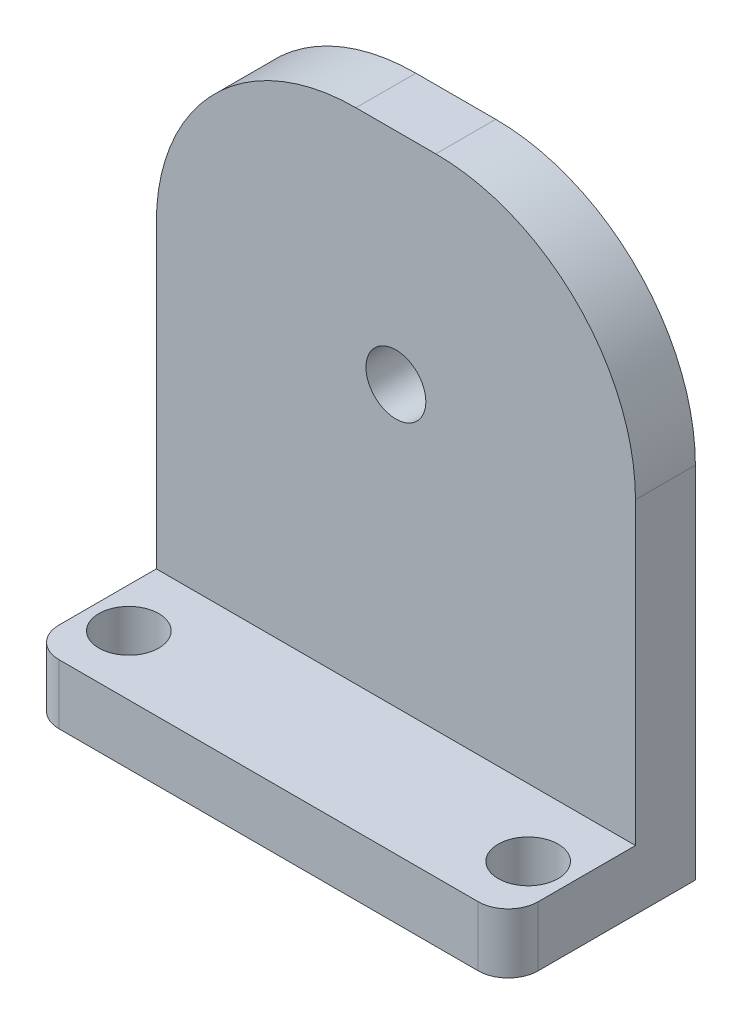
ISO-10303-21;
HEADER;
FILE_DESCRIPTION(('STEP AP214'),'2;1');
FILE_NAME('part.step','',(''),(''),'','','');
FILE_SCHEMA(('AUTOMOTIVE_DESIGN { 1 0 10303 214 1 1 1 1 }'));
ENDSEC;
DATA;
#1=APPLICATION_CONTEXT('core data for automotive mechanical design processes');
#2=APPLICATION_PROTOCOL_DEFINITION('international standard','automotive_design',2000,#1);
#3=PRODUCT_CONTEXT('',#1,'mechanical');
#4=PRODUCT('Part','Part','',(#3));
#5=PRODUCT_RELATED_PRODUCT_CATEGORY('part','',(#4));
#6=PRODUCT_DEFINITION_FORMATION('','',#4);
#7=PRODUCT_DEFINITION_CONTEXT('part definition',#1,'design');
#8=PRODUCT_DEFINITION('design','',#6,#7);
#9=PRODUCT_DEFINITION_SHAPE('','',#8);
#10=(LENGTH_UNIT() NAMED_UNIT(*) SI_UNIT(.MILLI.,.METRE.));
#11=(NAMED_UNIT(*) PLANE_ANGLE_UNIT() SI_UNIT($,.RADIAN.));
#12=(NAMED_UNIT(*) SI_UNIT($,.STERADIAN.) SOLID_ANGLE_UNIT());
#13=UNCERTAINTY_MEASURE_WITH_UNIT(LENGTH_MEASURE(1.E-05),#10,'distance_accuracy_value','');
#14=(GEOMETRIC_REPRESENTATION_CONTEXT(3) GLOBAL_UNCERTAINTY_ASSIGNED_CONTEXT((#13)) GLOBAL_UNIT_ASSIGNED_CONTEXT((#10,
#11,#12)) REPRESENTATION_CONTEXT('',''));
#15=CARTESIAN_POINT('',(0.,0.,0.));
#16=DIRECTION('',(0.,0.,1.));
#17=DIRECTION('',(1.,0.,0.));
#18=AXIS2_PLACEMENT_3D('',#15,#16,#17);
#19=CARTESIAN_POINT('',(12.,3.,0.));
#20=DIRECTION('',(1.,0.,0.));
#21=DIRECTION('',(0.,0.,-1.));
#22=AXIS2_PLACEMENT_3D('',#19,#20,#21);
#23=PLANE('',#22);
#24=DIRECTION('',(0.,-1.,0.));
#25=VECTOR('',#24,1.);
#26=CARTESIAN_POINT('',(12.,3.,-6.37567259259259));
#27=LINE('',#26,#25);
#28=CARTESIAN_POINT('',(12.,18.,-6.37567259259259));
#29=VERTEX_POINT('',#28);
#30=CARTESIAN_POINT('',(12.,0.,-6.37567259259259));
#31=VERTEX_POINT('',#30);
#32=EDGE_CURVE('E208',#29,#31,#27,.T.);
#33=ORIENTED_EDGE('',*,*,#32,.F.);
#34=DIRECTION('',(0.,0.,-1.));
#35=VECTOR('',#34,1.);
#36=CARTESIAN_POINT('',(12.,18.,0.));
#37=LINE('',#36,#35);
#38=CARTESIAN_POINT('',(12.,18.,-3.37567259259259));
#39=VERTEX_POINT('',#38);
#40=EDGE_CURVE('E11',#29,#39,#37,.F.);
#41=ORIENTED_EDGE('',*,*,#40,.T.);
#42=DIRECTION('',(0.,-1.,0.));
#43=VECTOR('',#42,1.);
#44=CARTESIAN_POINT('',(12.,28.,-3.37567259259259));
#45=LINE('',#44,#43);
#46=CARTESIAN_POINT('',(12.,3.,-3.37567259259259));
#47=VERTEX_POINT('',#46);
#48=EDGE_CURVE('E123',#39,#47,#45,.T.);
#49=ORIENTED_EDGE('',*,*,#48,.T.);
#50=DIRECTION('',(0.,0.,1.));
#51=VECTOR('',#50,1.);
#52=CARTESIAN_POINT('',(12.,3.,0.));
#53=LINE('',#52,#51);
#54=CARTESIAN_POINT('',(12.,3.,1.49999999999999));
#55=VERTEX_POINT('',#54);
#56=EDGE_CURVE('E125',#47,#55,#53,.T.);
#57=ORIENTED_EDGE('',*,*,#56,.T.);
#58=DIRECTION('',(0.,-1.,0.));
#59=VECTOR('',#58,1.);
#60=CARTESIAN_POINT('',(12.,3.,1.49999999999999));
#61=LINE('',#60,#59);
#62=CARTESIAN_POINT('',(12.,0.,1.49999999999999));
#63=VERTEX_POINT('',#62);
#64=EDGE_CURVE('E176',#55,#63,#61,.T.);
#65=ORIENTED_EDGE('',*,*,#64,.T.);
#66=DIRECTION('',(0.,0.,1.));
#67=VECTOR('',#66,1.);
#68=CARTESIAN_POINT('',(12.,0.,0.));
#69=LINE('',#68,#67);
#70=EDGE_CURVE('E160',#31,#63,#69,.T.);
#71=ORIENTED_EDGE('',*,*,#70,.F.);
#72=EDGE_LOOP('',(#33,#41,#49,#57,#65,#71));
#73=FACE_BOUND('',#72,.T.);
#74=ADVANCED_FACE('F47',(#73),#23,.T.);
#75=CARTESIAN_POINT('',(0.,3.,-6.37567259259259));
#76=DIRECTION('',(0.,0.,-1.));
#77=DIRECTION('',(-1.,0.,0.));
#78=AXIS2_PLACEMENT_3D('',#75,#76,#77);
#79=PLANE('',#78);
#80=CARTESIAN_POINT('',(0.,17.,-6.37567259259259));
#81=DIRECTION('',(0.,0.,1.));
#82=DIRECTION('',(1.,0.,0.));
#83=AXIS2_PLACEMENT_3D('',#80,#81,#82);
#84=CIRCLE('',#83,1.5);
#85=CARTESIAN_POINT('',(1.5,17.,-6.37567259259259));
#86=VERTEX_POINT('',#85);
#87=EDGE_CURVE('E151',#86,#86,#84,.T.);
#88=ORIENTED_EDGE('',*,*,#87,.T.);
#89=EDGE_LOOP('',(#88));
#90=FACE_BOUND('',#89,.T.);
#91=DIRECTION('',(0.,-1.,0.));
#92=VECTOR('',#91,1.);
#93=CARTESIAN_POINT('',(-12.,3.,-6.37567259259259));
#94=LINE('',#93,#92);
#95=CARTESIAN_POINT('',(-12.,18.,-6.37567259259259));
#96=VERTEX_POINT('',#95);
#97=CARTESIAN_POINT('',(-12.,0.,-6.37567259259259));
#98=VERTEX_POINT('',#97);
#99=EDGE_CURVE('E206',#96,#98,#94,.T.);
#100=ORIENTED_EDGE('',*,*,#99,.F.);
#101=CARTESIAN_POINT('',(-2.,18.,-6.37567259259259));
#102=DIRECTION('',(0.,0.,-1.));
#103=DIRECTION('',(-1.,0.,0.));
#104=AXIS2_PLACEMENT_3D('',#101,#102,#103);
#105=CIRCLE('',#104,10.);
#106=CARTESIAN_POINT('',(-2.,28.,-6.37567259259259));
#107=VERTEX_POINT('',#106);
#108=EDGE_CURVE('E55',#96,#107,#105,.T.);
#109=ORIENTED_EDGE('',*,*,#108,.T.);
#110=DIRECTION('',(-1.,0.,0.));
#111=VECTOR('',#110,1.);
#112=CARTESIAN_POINT('',(12.,28.,-6.37567259259259));
#113=LINE('',#112,#111);
#114=CARTESIAN_POINT('',(2.,28.,-6.37567259259259));
#115=VERTEX_POINT('',#114);
#116=EDGE_CURVE('E150',#115,#107,#113,.T.);
#117=ORIENTED_EDGE('',*,*,#116,.F.);
#118=CARTESIAN_POINT('',(2.,18.,-6.37567259259259));
#119=DIRECTION('',(0.,0.,-1.));
#120=DIRECTION('',(-1.,0.,0.));
#121=AXIS2_PLACEMENT_3D('',#118,#119,#120);
#122=CIRCLE('',#121,10.);
#123=EDGE_CURVE('E62',#115,#29,#122,.T.);
#124=ORIENTED_EDGE('',*,*,#123,.T.);
#125=ORIENTED_EDGE('',*,*,#32,.T.);
#126=DIRECTION('',(1.,0.,0.));
#127=VECTOR('',#126,1.);
#128=CARTESIAN_POINT('',(0.,0.,-6.37567259259259));
#129=LINE('',#128,#127);
#130=EDGE_CURVE('E179',#98,#31,#129,.T.);
#131=ORIENTED_EDGE('',*,*,#130,.F.);
#132=EDGE_LOOP('',(#100,#109,#117,#124,#125,#131));
#133=FACE_BOUND('',#132,.T.);
#134=ADVANCED_FACE('F222',(#90,#133),#79,.T.);
#135=CARTESIAN_POINT('',(-12.,3.,0.));
#136=DIRECTION('',(-1.,0.,0.));
#137=DIRECTION('',(0.,0.,1.));
#138=AXIS2_PLACEMENT_3D('',#135,#136,#137);
#139=PLANE('',#138);
#140=DIRECTION('',(0.,-1.,0.));
#141=VECTOR('',#140,1.);
#142=CARTESIAN_POINT('',(-12.,28.,-3.37567259259259));
#143=LINE('',#142,#141);
#144=CARTESIAN_POINT('',(-12.,18.,-3.37567259259259));
#145=VERTEX_POINT('',#144);
#146=CARTESIAN_POINT('',(-12.,3.,-3.37567259259259));
#147=VERTEX_POINT('',#146);
#148=EDGE_CURVE('E131',#145,#147,#143,.T.);
#149=ORIENTED_EDGE('',*,*,#148,.F.);
#150=DIRECTION('',(0.,0.,1.));
#151=VECTOR('',#150,1.);
#152=CARTESIAN_POINT('',(-12.,18.,0.));
#153=LINE('',#152,#151);
#154=EDGE_CURVE('E70',#145,#96,#153,.F.);
#155=ORIENTED_EDGE('',*,*,#154,.T.);
#156=ORIENTED_EDGE('',*,*,#99,.T.);
#157=DIRECTION('',(0.,0.,-1.));
#158=VECTOR('',#157,1.);
#159=CARTESIAN_POINT('',(-12.,0.,0.));
#160=LINE('',#159,#158);
#161=CARTESIAN_POINT('',(-12.,0.,1.49999999999999));
#162=VERTEX_POINT('',#161);
#163=EDGE_CURVE('E182',#162,#98,#160,.T.);
#164=ORIENTED_EDGE('',*,*,#163,.F.);
#165=DIRECTION('',(0.,-1.,0.));
#166=VECTOR('',#165,1.);
#167=CARTESIAN_POINT('',(-12.,3.,1.49999999999999));
#168=LINE('',#167,#166);
#169=CARTESIAN_POINT('',(-12.,3.,1.49999999999999));
#170=VERTEX_POINT('',#169);
#171=EDGE_CURVE('E204',#170,#162,#168,.T.);
#172=ORIENTED_EDGE('',*,*,#171,.F.);
#173=DIRECTION('',(0.,0.,-1.));
#174=VECTOR('',#173,1.);
#175=CARTESIAN_POINT('',(-12.,3.,0.));
#176=LINE('',#175,#174);
#177=EDGE_CURVE('E145',#170,#147,#176,.T.);
#178=ORIENTED_EDGE('',*,*,#177,.T.);
#179=EDGE_LOOP('',(#149,#155,#156,#164,#172,#178));
#180=FACE_BOUND('',#179,.T.);
#181=ADVANCED_FACE('F231',(#180),#139,.T.);
#182=CARTESIAN_POINT('',(-10.5,3.,1.5));
#183=DIRECTION('',(0.,-1.,0.));
#184=DIRECTION('',(0.,0.,-1.));
#185=AXIS2_PLACEMENT_3D('',#182,#183,#184);
#186=CYLINDRICAL_SURFACE('',#185,1.5);
#187=CARTESIAN_POINT('',(-10.5,0.,1.5));
#188=DIRECTION('',(0.,1.,0.));
#189=DIRECTION('',(0.,0.,1.));
#190=AXIS2_PLACEMENT_3D('',#187,#188,#189);
#191=CIRCLE('',#190,1.5);
#192=CARTESIAN_POINT('',(-10.5,0.,3.));
#193=VERTEX_POINT('',#192);
#194=EDGE_CURVE('E185',#193,#162,#191,.F.);
#195=ORIENTED_EDGE('',*,*,#194,.F.);
#196=DIRECTION('',(0.,-1.,0.));
#197=VECTOR('',#196,1.);
#198=CARTESIAN_POINT('',(-10.5,3.,3.));
#199=LINE('',#198,#197);
#200=CARTESIAN_POINT('',(-10.5,3.,3.));
#201=VERTEX_POINT('',#200);
#202=EDGE_CURVE('E202',#201,#193,#199,.T.);
#203=ORIENTED_EDGE('',*,*,#202,.F.);
#204=CARTESIAN_POINT('',(-10.5,3.,1.5));
#205=DIRECTION('',(0.,1.,0.));
#206=DIRECTION('',(0.,0.,1.));
#207=AXIS2_PLACEMENT_3D('',#204,#205,#206);
#208=CIRCLE('',#207,1.5);
#209=EDGE_CURVE('E163',#201,#170,#208,.F.);
#210=ORIENTED_EDGE('',*,*,#209,.T.);
#211=ORIENTED_EDGE('',*,*,#171,.T.);
#212=EDGE_LOOP('',(#195,#203,#210,#211));
#213=FACE_BOUND('',#212,.T.);
#214=ADVANCED_FACE('F236',(#213),#186,.T.);
#215=CARTESIAN_POINT('',(0.,3.,3.));
#216=DIRECTION('',(0.,0.,1.));
#217=DIRECTION('',(1.,0.,0.));
#218=AXIS2_PLACEMENT_3D('',#215,#216,#217);
#219=PLANE('',#218);
#220=DIRECTION('',(-1.,0.,0.));
#221=VECTOR('',#220,1.);
#222=CARTESIAN_POINT('',(0.,0.,3.));
#223=LINE('',#222,#221);
#224=CARTESIAN_POINT('',(10.5,0.,3.));
#225=VERTEX_POINT('',#224);
#226=EDGE_CURVE('E188',#225,#193,#223,.T.);
#227=ORIENTED_EDGE('',*,*,#226,.F.);
#228=DIRECTION('',(0.,-1.,0.));
#229=VECTOR('',#228,1.);
#230=CARTESIAN_POINT('',(10.5,3.,3.));
#231=LINE('',#230,#229);
#232=CARTESIAN_POINT('',(10.5,3.,3.));
#233=VERTEX_POINT('',#232);
#234=EDGE_CURVE('E200',#233,#225,#231,.T.);
#235=ORIENTED_EDGE('',*,*,#234,.F.);
#236=DIRECTION('',(-1.,0.,0.));
#237=VECTOR('',#236,1.);
#238=CARTESIAN_POINT('',(0.,3.,3.));
#239=LINE('',#238,#237);
#240=EDGE_CURVE('E166',#233,#201,#239,.T.);
#241=ORIENTED_EDGE('',*,*,#240,.T.);
#242=ORIENTED_EDGE('',*,*,#202,.T.);
#243=EDGE_LOOP('',(#227,#235,#241,#242));
#244=FACE_BOUND('',#243,.T.);
#245=ADVANCED_FACE('F239',(#244),#219,.T.);
#246=CARTESIAN_POINT('',(10.,3.,0.));
#247=DIRECTION('',(0.,-1.,0.));
#248=DIRECTION('',(0.,0.,-1.));
#249=AXIS2_PLACEMENT_3D('',#246,#247,#248);
#250=CYLINDRICAL_SURFACE('',#249,1.5);
#251=CARTESIAN_POINT('',(10.,3.,0.));
#252=DIRECTION('',(0.,1.,0.));
#253=DIRECTION('',(0.,0.,1.));
#254=AXIS2_PLACEMENT_3D('',#251,#252,#253);
#255=CIRCLE('',#254,1.5);
#256=CARTESIAN_POINT('',(10.,3.,1.5));
#257=VERTEX_POINT('',#256);
#258=EDGE_CURVE('E170',#257,#257,#255,.T.);
#259=ORIENTED_EDGE('',*,*,#258,.T.);
#260=EDGE_LOOP('',(#259));
#261=FACE_BOUND('',#260,.T.);
#262=CARTESIAN_POINT('',(10.,0.,0.));
#263=DIRECTION('',(0.,1.,0.));
#264=DIRECTION('',(0.,0.,1.));
#265=AXIS2_PLACEMENT_3D('',#262,#263,#264);
#266=CIRCLE('',#265,1.5);
#267=CARTESIAN_POINT('',(10.,0.,1.5));
#268=VERTEX_POINT('',#267);
#269=EDGE_CURVE('E194',#268,#268,#266,.T.);
#270=ORIENTED_EDGE('',*,*,#269,.F.);
#271=EDGE_LOOP('',(#270));
#272=FACE_BOUND('',#271,.T.);
#273=ADVANCED_FACE('F271',(#261,#272),#250,.F.);
#274=CARTESIAN_POINT('',(10.5,3.,1.5));
#275=DIRECTION('',(0.,-1.,0.));
#276=DIRECTION('',(0.,0.,-1.));
#277=AXIS2_PLACEMENT_3D('',#274,#275,#276);
#278=CYLINDRICAL_SURFACE('',#277,1.5);
#279=CARTESIAN_POINT('',(10.5,0.,1.5));
#280=DIRECTION('',(0.,1.,0.));
#281=DIRECTION('',(0.,0.,1.));
#282=AXIS2_PLACEMENT_3D('',#279,#280,#281);
#283=CIRCLE('',#282,1.5);
#284=EDGE_CURVE('E191',#63,#225,#283,.F.);
#285=ORIENTED_EDGE('',*,*,#284,.F.);
#286=ORIENTED_EDGE('',*,*,#64,.F.);
#287=CARTESIAN_POINT('',(10.5,3.,1.5));
#288=DIRECTION('',(0.,1.,0.));
#289=DIRECTION('',(0.,0.,1.));
#290=AXIS2_PLACEMENT_3D('',#287,#288,#289);
#291=CIRCLE('',#290,1.5);
#292=EDGE_CURVE('E144',#55,#233,#291,.F.);
#293=ORIENTED_EDGE('',*,*,#292,.T.);
#294=ORIENTED_EDGE('',*,*,#234,.T.);
#295=EDGE_LOOP('',(#285,#286,#293,#294));
#296=FACE_BOUND('',#295,.T.);
#297=ADVANCED_FACE('F242',(#296),#278,.T.);
#298=CARTESIAN_POINT('',(-10.,3.,0.));
#299=DIRECTION('',(0.,-1.,0.));
#300=DIRECTION('',(0.,0.,-1.));
#301=AXIS2_PLACEMENT_3D('',#298,#299,#300);
#302=CYLINDRICAL_SURFACE('',#301,1.5);
#303=CARTESIAN_POINT('',(-10.,3.,0.));
#304=DIRECTION('',(0.,1.,0.));
#305=DIRECTION('',(0.,0.,1.));
#306=AXIS2_PLACEMENT_3D('',#303,#304,#305);
#307=CIRCLE('',#306,1.5);
#308=CARTESIAN_POINT('',(-10.,3.,1.5));
#309=VERTEX_POINT('',#308);
#310=EDGE_CURVE('E173',#309,#309,#307,.T.);
#311=ORIENTED_EDGE('',*,*,#310,.T.);
#312=EDGE_LOOP('',(#311));
#313=FACE_BOUND('',#312,.T.);
#314=CARTESIAN_POINT('',(-10.,0.,0.));
#315=DIRECTION('',(0.,1.,0.));
#316=DIRECTION('',(0.,0.,1.));
#317=AXIS2_PLACEMENT_3D('',#314,#315,#316);
#318=CIRCLE('',#317,1.5);
#319=CARTESIAN_POINT('',(-10.,0.,1.5));
#320=VERTEX_POINT('',#319);
#321=EDGE_CURVE('E146',#320,#320,#318,.T.);
#322=ORIENTED_EDGE('',*,*,#321,.F.);
#323=EDGE_LOOP('',(#322));
#324=FACE_BOUND('',#323,.T.);
#325=ADVANCED_FACE('F274',(#313,#324),#302,.F.);
#326=CARTESIAN_POINT('',(0.,3.,0.));
#327=DIRECTION('',(0.,1.,0.));
#328=DIRECTION('',(0.,0.,1.));
#329=AXIS2_PLACEMENT_3D('',#326,#327,#328);
#330=PLANE('',#329);
#331=DIRECTION('',(1.,0.,0.));
#332=VECTOR('',#331,1.);
#333=CARTESIAN_POINT('',(-12.,3.,-3.37567259259259));
#334=LINE('',#333,#332);
#335=EDGE_CURVE('E140',#147,#47,#334,.T.);
#336=ORIENTED_EDGE('',*,*,#335,.F.);
#337=ORIENTED_EDGE('',*,*,#177,.F.);
#338=ORIENTED_EDGE('',*,*,#209,.F.);
#339=ORIENTED_EDGE('',*,*,#240,.F.);
#340=ORIENTED_EDGE('',*,*,#292,.F.);
#341=ORIENTED_EDGE('',*,*,#56,.F.);
#342=EDGE_LOOP('',(#336,#337,#338,#339,#340,#341));
#343=FACE_BOUND('',#342,.T.);
#344=ORIENTED_EDGE('',*,*,#258,.F.);
#345=EDGE_LOOP('',(#344));
#346=FACE_BOUND('',#345,.T.);
#347=ORIENTED_EDGE('',*,*,#310,.F.);
#348=EDGE_LOOP('',(#347));
#349=FACE_BOUND('',#348,.T.);
#350=ADVANCED_FACE('F137',(#343,#346,#349),#330,.T.);
#351=CARTESIAN_POINT('',(0.,0.,0.));
#352=DIRECTION('',(0.,1.,0.));
#353=DIRECTION('',(0.,0.,1.));
#354=AXIS2_PLACEMENT_3D('',#351,#352,#353);
#355=PLANE('',#354);
#356=ORIENTED_EDGE('',*,*,#70,.T.);
#357=ORIENTED_EDGE('',*,*,#284,.T.);
#358=ORIENTED_EDGE('',*,*,#226,.T.);
#359=ORIENTED_EDGE('',*,*,#194,.T.);
#360=ORIENTED_EDGE('',*,*,#163,.T.);
#361=ORIENTED_EDGE('',*,*,#130,.T.);
#362=EDGE_LOOP('',(#356,#357,#358,#359,#360,#361));
#363=FACE_BOUND('',#362,.T.);
#364=ORIENTED_EDGE('',*,*,#269,.T.);
#365=EDGE_LOOP('',(#364));
#366=FACE_BOUND('',#365,.T.);
#367=ORIENTED_EDGE('',*,*,#321,.T.);
#368=EDGE_LOOP('',(#367));
#369=FACE_BOUND('',#368,.T.);
#370=ADVANCED_FACE('F245',(#363,#366,#369),#355,.F.);
#371=CARTESIAN_POINT('',(-12.,28.,-3.37567259259259));
#372=DIRECTION('',(0.,0.,-1.));
#373=DIRECTION('',(-1.,0.,0.));
#374=AXIS2_PLACEMENT_3D('',#371,#372,#373);
#375=PLANE('',#374);
#376=CARTESIAN_POINT('',(0.,17.,-3.37567259259259));
#377=DIRECTION('',(0.,0.,1.));
#378=DIRECTION('',(1.,0.,0.));
#379=AXIS2_PLACEMENT_3D('',#376,#377,#378);
#380=CIRCLE('',#379,1.5);
#381=CARTESIAN_POINT('',(1.5,17.,-3.37567259259259));
#382=VERTEX_POINT('',#381);
#383=EDGE_CURVE('E156',#382,#382,#380,.T.);
#384=ORIENTED_EDGE('',*,*,#383,.F.);
#385=EDGE_LOOP('',(#384));
#386=FACE_BOUND('',#385,.T.);
#387=DIRECTION('',(1.,0.,0.));
#388=VECTOR('',#387,1.);
#389=CARTESIAN_POINT('',(-12.,28.,-3.37567259259259));
#390=LINE('',#389,#388);
#391=CARTESIAN_POINT('',(-2.,28.,-3.37567259259259));
#392=VERTEX_POINT('',#391);
#393=CARTESIAN_POINT('',(2.,28.,-3.37567259259259));
#394=VERTEX_POINT('',#393);
#395=EDGE_CURVE('E132',#392,#394,#390,.T.);
#396=ORIENTED_EDGE('',*,*,#395,.F.);
#397=CARTESIAN_POINT('',(-2.,18.,-3.37567259259259));
#398=DIRECTION('',(0.,0.,-1.));
#399=DIRECTION('',(-1.,0.,0.));
#400=AXIS2_PLACEMENT_3D('',#397,#398,#399);
#401=CIRCLE('',#400,10.);
#402=EDGE_CURVE('E218',#392,#145,#401,.F.);
#403=ORIENTED_EDGE('',*,*,#402,.T.);
#404=ORIENTED_EDGE('',*,*,#148,.T.);
#405=ORIENTED_EDGE('',*,*,#335,.T.);
#406=ORIENTED_EDGE('',*,*,#48,.F.);
#407=CARTESIAN_POINT('',(2.,18.,-3.37567259259259));
#408=DIRECTION('',(0.,0.,-1.));
#409=DIRECTION('',(-1.,0.,0.));
#410=AXIS2_PLACEMENT_3D('',#407,#408,#409);
#411=CIRCLE('',#410,10.);
#412=EDGE_CURVE('E216',#39,#394,#411,.F.);
#413=ORIENTED_EDGE('',*,*,#412,.T.);
#414=EDGE_LOOP('',(#396,#403,#404,#405,#406,#413));
#415=FACE_BOUND('',#414,.T.);
#416=ADVANCED_FACE('F149',(#386,#415),#375,.F.);
#417=CARTESIAN_POINT('',(0.,28.,0.));
#418=DIRECTION('',(0.,1.,0.));
#419=DIRECTION('',(0.,0.,1.));
#420=AXIS2_PLACEMENT_3D('',#417,#418,#419);
#421=PLANE('',#420);
#422=ORIENTED_EDGE('',*,*,#116,.T.);
#423=DIRECTION('',(0.,0.,1.));
#424=VECTOR('',#423,1.);
#425=CARTESIAN_POINT('',(-2.,28.,0.));
#426=LINE('',#425,#424);
#427=EDGE_CURVE('E213',#107,#392,#426,.T.);
#428=ORIENTED_EDGE('',*,*,#427,.T.);
#429=ORIENTED_EDGE('',*,*,#395,.T.);
#430=DIRECTION('',(0.,0.,-1.));
#431=VECTOR('',#430,1.);
#432=CARTESIAN_POINT('',(2.,28.,0.));
#433=LINE('',#432,#431);
#434=EDGE_CURVE('E210',#394,#115,#433,.T.);
#435=ORIENTED_EDGE('',*,*,#434,.T.);
#436=EDGE_LOOP('',(#422,#428,#429,#435));
#437=FACE_BOUND('',#436,.T.);
#438=ADVANCED_FACE('F227',(#437),#421,.T.);
#439=CARTESIAN_POINT('',(-2.,18.,0.));
#440=DIRECTION('',(0.,0.,1.));
#441=DIRECTION('',(1.,0.,0.));
#442=AXIS2_PLACEMENT_3D('',#439,#440,#441);
#443=CYLINDRICAL_SURFACE('',#442,10.);
#444=ORIENTED_EDGE('',*,*,#108,.F.);
#445=ORIENTED_EDGE('',*,*,#154,.F.);
#446=ORIENTED_EDGE('',*,*,#402,.F.);
#447=ORIENTED_EDGE('',*,*,#427,.F.);
#448=EDGE_LOOP('',(#444,#445,#446,#447));
#449=FACE_BOUND('',#448,.T.);
#450=ADVANCED_FACE('F230',(#449),#443,.T.);
#451=CARTESIAN_POINT('',(2.,18.,0.));
#452=DIRECTION('',(0.,0.,-1.));
#453=DIRECTION('',(-1.,0.,0.));
#454=AXIS2_PLACEMENT_3D('',#451,#452,#453);
#455=CYLINDRICAL_SURFACE('',#454,10.);
#456=ORIENTED_EDGE('',*,*,#412,.F.);
#457=ORIENTED_EDGE('',*,*,#40,.F.);
#458=ORIENTED_EDGE('',*,*,#123,.F.);
#459=ORIENTED_EDGE('',*,*,#434,.F.);
#460=EDGE_LOOP('',(#456,#457,#458,#459));
#461=FACE_BOUND('',#460,.T.);
#462=ADVANCED_FACE('F49',(#461),#455,.T.);
#463=CARTESIAN_POINT('',(0.,17.,-6.37567259259259));
#464=DIRECTION('',(0.,0.,1.));
#465=DIRECTION('',(1.,0.,0.));
#466=AXIS2_PLACEMENT_3D('',#463,#464,#465);
#467=CYLINDRICAL_SURFACE('',#466,1.5);
#468=ORIENTED_EDGE('',*,*,#87,.F.);
#469=EDGE_LOOP('',(#468));
#470=FACE_BOUND('',#469,.T.);
#471=ORIENTED_EDGE('',*,*,#383,.T.);
#472=EDGE_LOOP('',(#471));
#473=FACE_BOUND('',#472,.T.);
#474=ADVANCED_FACE('F249',(#470,#473),#467,.F.);
#475=CLOSED_SHELL('',(#74,#134,#181,#214,#245,#273,#297,#325,#350,#370,#416,#438,#450,#462,#474));
#476=MANIFOLD_SOLID_BREP('B2',#475);
#477=ADVANCED_BREP_SHAPE_REPRESENTATION('',(#18,#476),#14);
#478=SHAPE_DEFINITION_REPRESENTATION(#9,#477);
ENDSEC;
END-ISO-10303-21;
